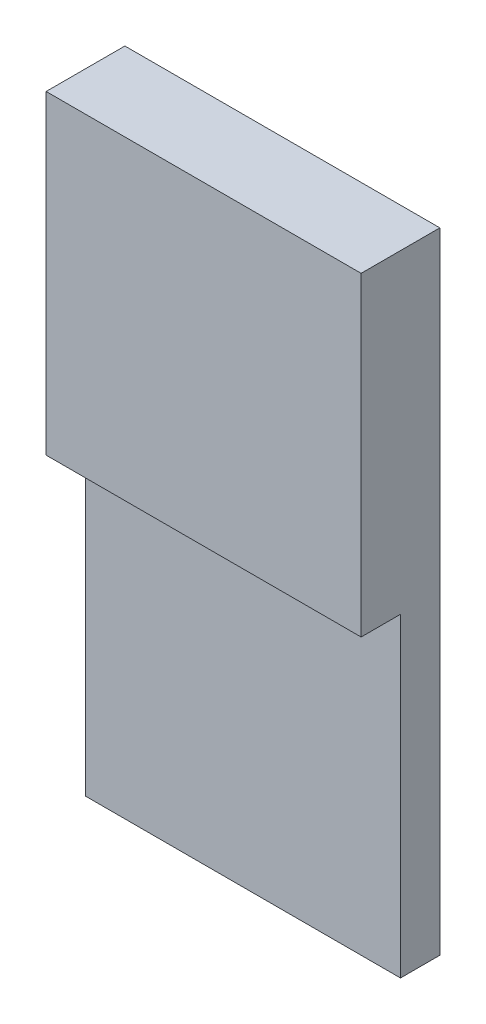
ISO-10303-21;
HEADER;
FILE_DESCRIPTION(('STEP AP214'),'2;1');
FILE_NAME('part.step','',(''),(''),'','','');
FILE_SCHEMA(('AUTOMOTIVE_DESIGN { 1 0 10303 214 1 1 1 1 }'));
ENDSEC;
DATA;
#1=APPLICATION_CONTEXT('core data for automotive mechanical design processes');
#2=APPLICATION_PROTOCOL_DEFINITION('international standard','automotive_design',2000,#1);
#3=PRODUCT_CONTEXT('',#1,'mechanical');
#4=PRODUCT('Part','Part','',(#3));
#5=PRODUCT_RELATED_PRODUCT_CATEGORY('part','',(#4));
#6=PRODUCT_DEFINITION_FORMATION('','',#4);
#7=PRODUCT_DEFINITION_CONTEXT('part definition',#1,'design');
#8=PRODUCT_DEFINITION('design','',#6,#7);
#9=PRODUCT_DEFINITION_SHAPE('','',#8);
#10=(LENGTH_UNIT() NAMED_UNIT(*) SI_UNIT(.MILLI.,.METRE.));
#11=(NAMED_UNIT(*) PLANE_ANGLE_UNIT() SI_UNIT($,.RADIAN.));
#12=(NAMED_UNIT(*) SI_UNIT($,.STERADIAN.) SOLID_ANGLE_UNIT());
#13=UNCERTAINTY_MEASURE_WITH_UNIT(LENGTH_MEASURE(1.E-05),#10,'distance_accuracy_value','');
#14=(GEOMETRIC_REPRESENTATION_CONTEXT(3) GLOBAL_UNCERTAINTY_ASSIGNED_CONTEXT((#13)) GLOBAL_UNIT_ASSIGNED_CONTEXT((#10,
#11,#12)) REPRESENTATION_CONTEXT('',''));
#15=CARTESIAN_POINT('',(0.,0.,0.));
#16=DIRECTION('',(0.,0.,1.));
#17=DIRECTION('',(1.,0.,0.));
#18=AXIS2_PLACEMENT_3D('',#15,#16,#17);
#19=CARTESIAN_POINT('',(100.,100.,25.));
#20=DIRECTION('',(-1.,0.,0.));
#21=DIRECTION('',(0.,-1.,0.));
#22=AXIS2_PLACEMENT_3D('',#19,#20,#21);
#23=PLANE('',#22);
#24=DIRECTION('',(0.,1.,0.));
#25=VECTOR('',#24,1.);
#26=CARTESIAN_POINT('',(100.,100.,0.));
#27=LINE('',#26,#25);
#28=CARTESIAN_POINT('',(100.,-100.,0.));
#29=VERTEX_POINT('',#28);
#30=CARTESIAN_POINT('',(100.,300.,0.));
#31=VERTEX_POINT('',#30);
#32=EDGE_CURVE('E107',#29,#31,#27,.T.);
#33=ORIENTED_EDGE('',*,*,#32,.T.);
#34=DIRECTION('',(0.,0.,-1.));
#35=VECTOR('',#34,1.);
#36=CARTESIAN_POINT('',(100.,300.,50.));
#37=LINE('',#36,#35);
#38=CARTESIAN_POINT('',(100.,300.,50.));
#39=VERTEX_POINT('',#38);
#40=EDGE_CURVE('E110',#39,#31,#37,.T.);
#41=ORIENTED_EDGE('',*,*,#40,.F.);
#42=DIRECTION('',(0.,-1.,0.));
#43=VECTOR('',#42,1.);
#44=CARTESIAN_POINT('',(100.,100.,50.));
#45=LINE('',#44,#43);
#46=CARTESIAN_POINT('',(100.,100.,50.));
#47=VERTEX_POINT('',#46);
#48=EDGE_CURVE('E128',#39,#47,#45,.T.);
#49=ORIENTED_EDGE('',*,*,#48,.T.);
#50=DIRECTION('',(0.,0.,-1.));
#51=VECTOR('',#50,1.);
#52=CARTESIAN_POINT('',(100.,100.,50.));
#53=LINE('',#52,#51);
#54=CARTESIAN_POINT('',(100.,100.,25.));
#55=VERTEX_POINT('',#54);
#56=EDGE_CURVE('E95',#47,#55,#53,.T.);
#57=ORIENTED_EDGE('',*,*,#56,.T.);
#58=DIRECTION('',(0.,1.,0.));
#59=VECTOR('',#58,1.);
#60=CARTESIAN_POINT('',(100.,100.,25.));
#61=LINE('',#60,#59);
#62=CARTESIAN_POINT('',(100.,-100.,25.));
#63=VERTEX_POINT('',#62);
#64=EDGE_CURVE('E100',#63,#55,#61,.T.);
#65=ORIENTED_EDGE('',*,*,#64,.F.);
#66=DIRECTION('',(0.,0.,-1.));
#67=VECTOR('',#66,1.);
#68=CARTESIAN_POINT('',(100.,-100.,25.));
#69=LINE('',#68,#67);
#70=EDGE_CURVE('E47',#63,#29,#69,.T.);
#71=ORIENTED_EDGE('',*,*,#70,.T.);
#72=EDGE_LOOP('',(#33,#41,#49,#57,#65,#71));
#73=FACE_BOUND('',#72,.T.);
#74=ADVANCED_FACE('F39',(#73),#23,.F.);
#75=CARTESIAN_POINT('',(-100.,100.,25.));
#76=DIRECTION('',(1.,0.,0.));
#77=DIRECTION('',(0.,1.,0.));
#78=AXIS2_PLACEMENT_3D('',#75,#76,#77);
#79=PLANE('',#78);
#80=DIRECTION('',(0.,-1.,0.));
#81=VECTOR('',#80,1.);
#82=CARTESIAN_POINT('',(-100.,100.,0.));
#83=LINE('',#82,#81);
#84=CARTESIAN_POINT('',(-100.,300.,0.));
#85=VERTEX_POINT('',#84);
#86=CARTESIAN_POINT('',(-100.,-100.,0.));
#87=VERTEX_POINT('',#86);
#88=EDGE_CURVE('E67',#85,#87,#83,.T.);
#89=ORIENTED_EDGE('',*,*,#88,.T.);
#90=DIRECTION('',(0.,0.,-1.));
#91=VECTOR('',#90,1.);
#92=CARTESIAN_POINT('',(-100.,-100.,25.));
#93=LINE('',#92,#91);
#94=CARTESIAN_POINT('',(-100.,-100.,25.));
#95=VERTEX_POINT('',#94);
#96=EDGE_CURVE('E11',#95,#87,#93,.T.);
#97=ORIENTED_EDGE('',*,*,#96,.F.);
#98=DIRECTION('',(0.,-1.,0.));
#99=VECTOR('',#98,1.);
#100=CARTESIAN_POINT('',(-100.,100.,25.));
#101=LINE('',#100,#99);
#102=CARTESIAN_POINT('',(-100.,100.,25.));
#103=VERTEX_POINT('',#102);
#104=EDGE_CURVE('E98',#103,#95,#101,.T.);
#105=ORIENTED_EDGE('',*,*,#104,.F.);
#106=DIRECTION('',(0.,0.,-1.));
#107=VECTOR('',#106,1.);
#108=CARTESIAN_POINT('',(-100.,100.,50.));
#109=LINE('',#108,#107);
#110=CARTESIAN_POINT('',(-100.,100.,50.));
#111=VERTEX_POINT('',#110);
#112=EDGE_CURVE('E86',#111,#103,#109,.T.);
#113=ORIENTED_EDGE('',*,*,#112,.F.);
#114=DIRECTION('',(0.,1.,0.));
#115=VECTOR('',#114,1.);
#116=CARTESIAN_POINT('',(-100.,100.,50.));
#117=LINE('',#116,#115);
#118=CARTESIAN_POINT('',(-100.,300.,50.));
#119=VERTEX_POINT('',#118);
#120=EDGE_CURVE('E139',#111,#119,#117,.T.);
#121=ORIENTED_EDGE('',*,*,#120,.T.);
#122=DIRECTION('',(0.,0.,-1.));
#123=VECTOR('',#122,1.);
#124=CARTESIAN_POINT('',(-100.,300.,50.));
#125=LINE('',#124,#123);
#126=EDGE_CURVE('E94',#119,#85,#125,.T.);
#127=ORIENTED_EDGE('',*,*,#126,.T.);
#128=EDGE_LOOP('',(#89,#97,#105,#113,#121,#127));
#129=FACE_BOUND('',#128,.T.);
#130=ADVANCED_FACE('F102',(#129),#79,.F.);
#131=CARTESIAN_POINT('',(-100.,-100.,25.));
#132=DIRECTION('',(0.,1.,0.));
#133=DIRECTION('',(0.,0.,1.));
#134=AXIS2_PLACEMENT_3D('',#131,#132,#133);
#135=PLANE('',#134);
#136=DIRECTION('',(1.,0.,0.));
#137=VECTOR('',#136,1.);
#138=CARTESIAN_POINT('',(-100.,-100.,0.));
#139=LINE('',#138,#137);
#140=EDGE_CURVE('E112',#87,#29,#139,.T.);
#141=ORIENTED_EDGE('',*,*,#140,.T.);
#142=ORIENTED_EDGE('',*,*,#70,.F.);
#143=DIRECTION('',(1.,0.,0.));
#144=VECTOR('',#143,1.);
#145=CARTESIAN_POINT('',(-100.,-100.,25.));
#146=LINE('',#145,#144);
#147=EDGE_CURVE('E55',#95,#63,#146,.T.);
#148=ORIENTED_EDGE('',*,*,#147,.F.);
#149=ORIENTED_EDGE('',*,*,#96,.T.);
#150=EDGE_LOOP('',(#141,#142,#148,#149));
#151=FACE_BOUND('',#150,.T.);
#152=ADVANCED_FACE('F162',(#151),#135,.F.);
#153=CARTESIAN_POINT('',(0.,0.,25.));
#154=DIRECTION('',(0.,0.,1.));
#155=DIRECTION('',(1.,0.,0.));
#156=AXIS2_PLACEMENT_3D('',#153,#154,#155);
#157=PLANE('',#156);
#158=ORIENTED_EDGE('',*,*,#64,.T.);
#159=DIRECTION('',(-1.,0.,0.));
#160=VECTOR('',#159,1.);
#161=CARTESIAN_POINT('',(-100.,100.,25.));
#162=LINE('',#161,#160);
#163=EDGE_CURVE('E76',#55,#103,#162,.T.);
#164=ORIENTED_EDGE('',*,*,#163,.T.);
#165=ORIENTED_EDGE('',*,*,#104,.T.);
#166=ORIENTED_EDGE('',*,*,#147,.T.);
#167=EDGE_LOOP('',(#158,#164,#165,#166));
#168=FACE_BOUND('',#167,.T.);
#169=ADVANCED_FACE('F97',(#168),#157,.T.);
#170=CARTESIAN_POINT('',(0.,0.,0.));
#171=DIRECTION('',(0.,0.,1.));
#172=DIRECTION('',(1.,0.,0.));
#173=AXIS2_PLACEMENT_3D('',#170,#171,#172);
#174=PLANE('',#173);
#175=ORIENTED_EDGE('',*,*,#32,.F.);
#176=ORIENTED_EDGE('',*,*,#140,.F.);
#177=ORIENTED_EDGE('',*,*,#88,.F.);
#178=DIRECTION('',(1.,0.,0.));
#179=VECTOR('',#178,1.);
#180=CARTESIAN_POINT('',(100.,300.,0.));
#181=LINE('',#180,#179);
#182=EDGE_CURVE('E123',#85,#31,#181,.T.);
#183=ORIENTED_EDGE('',*,*,#182,.T.);
#184=EDGE_LOOP('',(#175,#176,#177,#183));
#185=FACE_BOUND('',#184,.T.);
#186=ADVANCED_FACE('F121',(#185),#174,.F.);
#187=CARTESIAN_POINT('',(100.,100.,50.));
#188=DIRECTION('',(0.,-1.,0.));
#189=DIRECTION('',(0.,0.,-1.));
#190=AXIS2_PLACEMENT_3D('',#187,#188,#189);
#191=PLANE('',#190);
#192=ORIENTED_EDGE('',*,*,#163,.F.);
#193=ORIENTED_EDGE('',*,*,#56,.F.);
#194=DIRECTION('',(-1.,0.,0.));
#195=VECTOR('',#194,1.);
#196=CARTESIAN_POINT('',(100.,100.,50.));
#197=LINE('',#196,#195);
#198=EDGE_CURVE('E90',#47,#111,#197,.T.);
#199=ORIENTED_EDGE('',*,*,#198,.T.);
#200=ORIENTED_EDGE('',*,*,#112,.T.);
#201=EDGE_LOOP('',(#192,#193,#199,#200));
#202=FACE_BOUND('',#201,.T.);
#203=ADVANCED_FACE('F87',(#202),#191,.T.);
#204=CARTESIAN_POINT('',(100.,300.,50.));
#205=DIRECTION('',(0.,1.,0.));
#206=DIRECTION('',(0.,0.,1.));
#207=AXIS2_PLACEMENT_3D('',#204,#205,#206);
#208=PLANE('',#207);
#209=ORIENTED_EDGE('',*,*,#182,.F.);
#210=ORIENTED_EDGE('',*,*,#126,.F.);
#211=DIRECTION('',(1.,0.,0.));
#212=VECTOR('',#211,1.);
#213=CARTESIAN_POINT('',(100.,300.,50.));
#214=LINE('',#213,#212);
#215=EDGE_CURVE('E134',#119,#39,#214,.T.);
#216=ORIENTED_EDGE('',*,*,#215,.T.);
#217=ORIENTED_EDGE('',*,*,#40,.T.);
#218=EDGE_LOOP('',(#209,#210,#216,#217));
#219=FACE_BOUND('',#218,.T.);
#220=ADVANCED_FACE('F148',(#219),#208,.T.);
#221=CARTESIAN_POINT('',(0.,0.,50.));
#222=DIRECTION('',(0.,0.,1.));
#223=DIRECTION('',(1.,0.,0.));
#224=AXIS2_PLACEMENT_3D('',#221,#222,#223);
#225=PLANE('',#224);
#226=ORIENTED_EDGE('',*,*,#48,.F.);
#227=ORIENTED_EDGE('',*,*,#215,.F.);
#228=ORIENTED_EDGE('',*,*,#120,.F.);
#229=ORIENTED_EDGE('',*,*,#198,.F.);
#230=EDGE_LOOP('',(#226,#227,#228,#229));
#231=FACE_BOUND('',#230,.T.);
#232=ADVANCED_FACE('F145',(#231),#225,.T.);
#233=CLOSED_SHELL('',(#74,#130,#152,#169,#186,#203,#220,#232));
#234=MANIFOLD_SOLID_BREP('B2',#233);
#235=ADVANCED_BREP_SHAPE_REPRESENTATION('',(#18,#234),#14);
#236=SHAPE_DEFINITION_REPRESENTATION(#9,#235);
ENDSEC;
END-ISO-10303-21;
